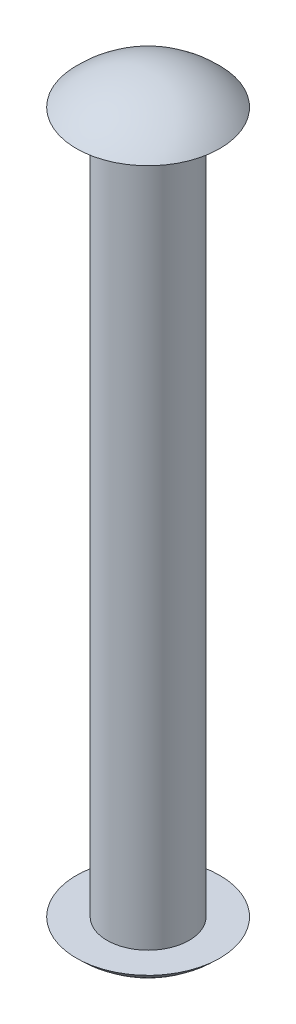
ISO-10303-21;
HEADER;
FILE_DESCRIPTION(('STEP AP214'),'2;1');
FILE_NAME('part.step','',(''),(''),'','','');
FILE_SCHEMA(('AUTOMOTIVE_DESIGN { 1 0 10303 214 1 1 1 1 }'));
ENDSEC;
DATA;
#1=APPLICATION_CONTEXT('core data for automotive mechanical design processes');
#2=APPLICATION_PROTOCOL_DEFINITION('international standard','automotive_design',2000,#1);
#3=PRODUCT_CONTEXT('',#1,'mechanical');
#4=PRODUCT('Part','Part','',(#3));
#5=PRODUCT_RELATED_PRODUCT_CATEGORY('part','',(#4));
#6=PRODUCT_DEFINITION_FORMATION('','',#4);
#7=PRODUCT_DEFINITION_CONTEXT('part definition',#1,'design');
#8=PRODUCT_DEFINITION('design','',#6,#7);
#9=PRODUCT_DEFINITION_SHAPE('','',#8);
#10=(LENGTH_UNIT() NAMED_UNIT(*) SI_UNIT(.MILLI.,.METRE.));
#11=(NAMED_UNIT(*) PLANE_ANGLE_UNIT() SI_UNIT($,.RADIAN.));
#12=(NAMED_UNIT(*) SI_UNIT($,.STERADIAN.) SOLID_ANGLE_UNIT());
#13=UNCERTAINTY_MEASURE_WITH_UNIT(LENGTH_MEASURE(1.E-05),#10,'distance_accuracy_value','');
#14=(GEOMETRIC_REPRESENTATION_CONTEXT(3) GLOBAL_UNCERTAINTY_ASSIGNED_CONTEXT((#13)) GLOBAL_UNIT_ASSIGNED_CONTEXT((#10,
#11,#12)) REPRESENTATION_CONTEXT('',''));
#15=CARTESIAN_POINT('',(0.,0.,0.));
#16=DIRECTION('',(0.,0.,1.));
#17=DIRECTION('',(1.,0.,0.));
#18=AXIS2_PLACEMENT_3D('',#15,#16,#17);
#19=CARTESIAN_POINT('',(2.54,21.717,0.));
#20=DIRECTION('',(0.,-1.,0.));
#21=DIRECTION('',(0.,0.,-1.));
#22=AXIS2_PLACEMENT_3D('',#19,#20,#21);
#23=PLANE('',#22);
#24=CARTESIAN_POINT('',(0.,21.717,0.));
#25=DIRECTION('',(0.,-1.,0.));
#26=DIRECTION('',(0.,0.,-1.));
#27=AXIS2_PLACEMENT_3D('',#24,#25,#26);
#28=CIRCLE('',#27,4.445);
#29=CARTESIAN_POINT('',(0.,21.717,-4.445));
#30=VERTEX_POINT('',#29);
#31=EDGE_CURVE('E12',#30,#30,#28,.T.);
#32=ORIENTED_EDGE('',*,*,#31,.T.);
#33=EDGE_LOOP('',(#32));
#34=FACE_BOUND('',#33,.T.);
#35=CARTESIAN_POINT('',(0.,21.717,0.));
#36=DIRECTION('',(0.,-1.,0.));
#37=DIRECTION('',(0.,0.,-1.));
#38=AXIS2_PLACEMENT_3D('',#35,#36,#37);
#39=CIRCLE('',#38,2.54000000000001);
#40=CARTESIAN_POINT('',(0.,21.717,-2.54000000000001));
#41=VERTEX_POINT('',#40);
#42=EDGE_CURVE('E58',#41,#41,#39,.T.);
#43=ORIENTED_EDGE('',*,*,#42,.F.);
#44=EDGE_LOOP('',(#43));
#45=FACE_BOUND('',#44,.T.);
#46=ADVANCED_FACE('F44',(#34,#45),#23,.T.);
#47=CARTESIAN_POINT('',(0.,17.4836666666667,0.));
#48=DIRECTION('',(0.,-1.,0.));
#49=DIRECTION('',(1.,0.,0.));
#50=AXIS2_PLACEMENT_3D('',#47,#48,#49);
#51=SPHERICAL_SURFACE('',#50,6.13833333333333);
#52=ORIENTED_EDGE('',*,*,#31,.F.);
#53=EDGE_LOOP('',(#52));
#54=FACE_BOUND('',#53,.T.);
#55=ADVANCED_FACE('F68',(#54),#51,.T.);
#56=CARTESIAN_POINT('',(0.,-17.4836666666667,0.));
#57=DIRECTION('',(0.,-1.,0.));
#58=DIRECTION('',(1.,0.,0.));
#59=AXIS2_PLACEMENT_3D('',#56,#57,#58);
#60=SPHERICAL_SURFACE('',#59,6.13833333333333);
#61=CARTESIAN_POINT('',(0.,-21.717,0.));
#62=DIRECTION('',(0.,-1.,0.));
#63=DIRECTION('',(0.,0.,-1.));
#64=AXIS2_PLACEMENT_3D('',#61,#62,#63);
#65=CIRCLE('',#64,4.445);
#66=CARTESIAN_POINT('',(0.,-21.717,-4.445));
#67=VERTEX_POINT('',#66);
#68=EDGE_CURVE('E50',#67,#67,#65,.T.);
#69=ORIENTED_EDGE('',*,*,#68,.T.);
#70=EDGE_LOOP('',(#69));
#71=FACE_BOUND('',#70,.T.);
#72=ADVANCED_FACE('F72',(#71),#60,.T.);
#73=CARTESIAN_POINT('',(2.54,-21.717,0.));
#74=DIRECTION('',(0.,1.,0.));
#75=DIRECTION('',(0.,0.,1.));
#76=AXIS2_PLACEMENT_3D('',#73,#74,#75);
#77=PLANE('',#76);
#78=CARTESIAN_POINT('',(0.,-21.717,0.));
#79=DIRECTION('',(0.,-1.,0.));
#80=DIRECTION('',(0.,0.,-1.));
#81=AXIS2_PLACEMENT_3D('',#78,#79,#80);
#82=CIRCLE('',#81,2.54000000000001);
#83=CARTESIAN_POINT('',(0.,-21.717,-2.54000000000001));
#84=VERTEX_POINT('',#83);
#85=EDGE_CURVE('E54',#84,#84,#82,.T.);
#86=ORIENTED_EDGE('',*,*,#85,.T.);
#87=EDGE_LOOP('',(#86));
#88=FACE_BOUND('',#87,.T.);
#89=ORIENTED_EDGE('',*,*,#68,.F.);
#90=EDGE_LOOP('',(#89));
#91=FACE_BOUND('',#90,.T.);
#92=ADVANCED_FACE('F77',(#88,#91),#77,.T.);
#93=CARTESIAN_POINT('',(0.,0.,0.));
#94=DIRECTION('',(0.,-1.,0.));
#95=DIRECTION('',(0.,0.,-1.));
#96=AXIS2_PLACEMENT_3D('',#93,#94,#95);
#97=CYLINDRICAL_SURFACE('',#96,2.54000000000001);
#98=ORIENTED_EDGE('',*,*,#42,.T.);
#99=EDGE_LOOP('',(#98));
#100=FACE_BOUND('',#99,.T.);
#101=ORIENTED_EDGE('',*,*,#85,.F.);
#102=EDGE_LOOP('',(#101));
#103=FACE_BOUND('',#102,.T.);
#104=ADVANCED_FACE('F64',(#100,#103),#97,.T.);
#105=CLOSED_SHELL('',(#46,#55,#72,#92,#104));
#106=MANIFOLD_SOLID_BREP('B2',#105);
#107=ADVANCED_BREP_SHAPE_REPRESENTATION('',(#18,#106),#14);
#108=SHAPE_DEFINITION_REPRESENTATION(#9,#107);
ENDSEC;
END-ISO-10303-21;
